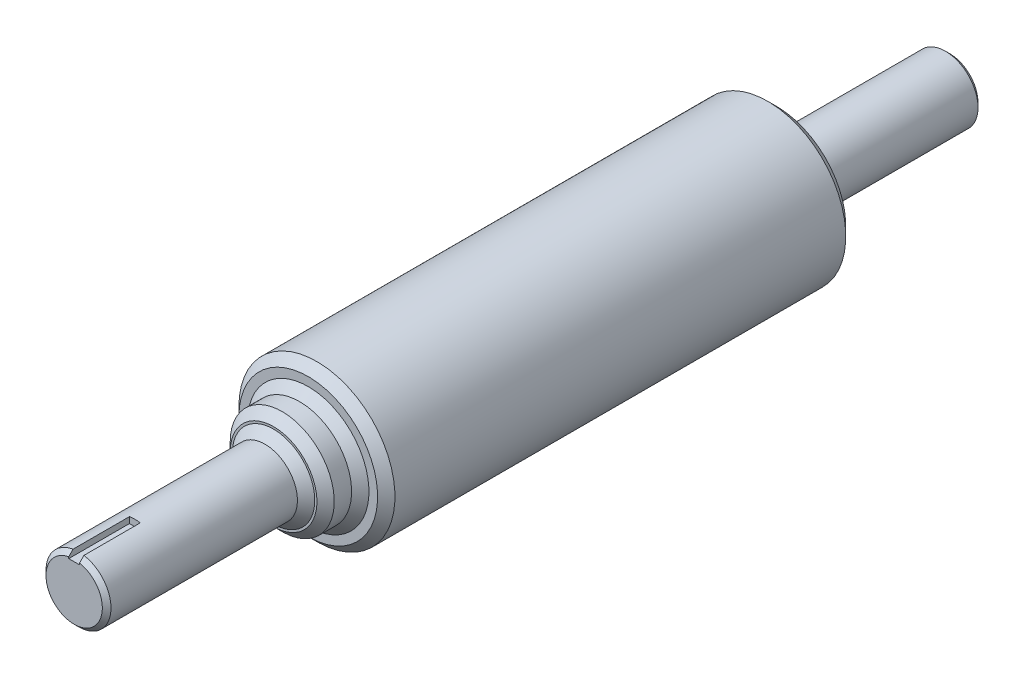
ISO-10303-21;
HEADER;
FILE_DESCRIPTION(('STEP AP214'),'2;1');
FILE_NAME('part.step','',(''),(''),'','','');
FILE_SCHEMA(('AUTOMOTIVE_DESIGN { 1 0 10303 214 1 1 1 1 }'));
ENDSEC;
DATA;
#1=APPLICATION_CONTEXT('core data for automotive mechanical design processes');
#2=APPLICATION_PROTOCOL_DEFINITION('international standard','automotive_design',2000,#1);
#3=PRODUCT_CONTEXT('',#1,'mechanical');
#4=PRODUCT('Part','Part','',(#3));
#5=PRODUCT_RELATED_PRODUCT_CATEGORY('part','',(#4));
#6=PRODUCT_DEFINITION_FORMATION('','',#4);
#7=PRODUCT_DEFINITION_CONTEXT('part definition',#1,'design');
#8=PRODUCT_DEFINITION('design','',#6,#7);
#9=PRODUCT_DEFINITION_SHAPE('','',#8);
#10=(LENGTH_UNIT() NAMED_UNIT(*) SI_UNIT(.MILLI.,.METRE.));
#11=(NAMED_UNIT(*) PLANE_ANGLE_UNIT() SI_UNIT($,.RADIAN.));
#12=(NAMED_UNIT(*) SI_UNIT($,.STERADIAN.) SOLID_ANGLE_UNIT());
#13=UNCERTAINTY_MEASURE_WITH_UNIT(LENGTH_MEASURE(1.E-05),#10,'distance_accuracy_value','');
#14=(GEOMETRIC_REPRESENTATION_CONTEXT(3) GLOBAL_UNCERTAINTY_ASSIGNED_CONTEXT((#13)) GLOBAL_UNIT_ASSIGNED_CONTEXT((#10,
#11,#12)) REPRESENTATION_CONTEXT('',''));
#15=CARTESIAN_POINT('',(0.,0.,0.));
#16=DIRECTION('',(0.,0.,1.));
#17=DIRECTION('',(1.,0.,0.));
#18=AXIS2_PLACEMENT_3D('',#15,#16,#17);
#19=CARTESIAN_POINT('',(0.,0.,-38.1));
#20=DIRECTION('',(0.,0.,1.));
#21=DIRECTION('',(1.,0.,0.));
#22=AXIS2_PLACEMENT_3D('',#19,#20,#21);
#23=CYLINDRICAL_SURFACE('',#22,47.625);
#24=CARTESIAN_POINT('',(0.,0.,-25.3999999999999));
#25=DIRECTION('',(0.,0.,-1.));
#26=DIRECTION('',(-1.,0.,0.));
#27=AXIS2_PLACEMENT_3D('',#24,#25,#26);
#28=CIRCLE('',#27,47.625);
#29=CARTESIAN_POINT('',(-47.625,0.,-25.3999999999999));
#30=VERTEX_POINT('',#29);
#31=EDGE_CURVE('E114',#30,#30,#28,.F.);
#32=ORIENTED_EDGE('',*,*,#31,.T.);
#33=EDGE_LOOP('',(#32));
#34=FACE_BOUND('',#33,.T.);
#35=DIRECTION('',(0.,0.,1.));
#36=VECTOR('',#35,1.);
#37=CARTESIAN_POINT('',(7.9375,46.9588832783532,-38.1));
#38=LINE('',#37,#36);
#39=CARTESIAN_POINT('',(7.9375,46.9588832783532,165.1));
#40=VERTEX_POINT('',#39);
#41=CARTESIAN_POINT('',(7.9375,46.9588832783532,247.65));
#42=VERTEX_POINT('',#41);
#43=EDGE_CURVE('E89',#40,#42,#38,.T.);
#44=ORIENTED_EDGE('',*,*,#43,.T.);
#45=CARTESIAN_POINT('',(0.,0.,247.65));
#46=DIRECTION('',(0.,0.,1.));
#47=DIRECTION('',(1.,0.,0.));
#48=AXIS2_PLACEMENT_3D('',#45,#46,#47);
#49=CIRCLE('',#48,47.625);
#50=CARTESIAN_POINT('',(-7.9375,46.9588832783532,247.65));
#51=VERTEX_POINT('',#50);
#52=EDGE_CURVE('E47',#42,#51,#49,.F.);
#53=ORIENTED_EDGE('',*,*,#52,.T.);
#54=DIRECTION('',(0.,0.,1.));
#55=VECTOR('',#54,1.);
#56=CARTESIAN_POINT('',(-7.9375,46.9588832783532,-38.1));
#57=LINE('',#56,#55);
#58=CARTESIAN_POINT('',(-7.9375,46.9588832783532,165.1));
#59=VERTEX_POINT('',#58);
#60=EDGE_CURVE('E106',#59,#51,#57,.T.);
#61=ORIENTED_EDGE('',*,*,#60,.F.);
#62=CARTESIAN_POINT('',(0.,0.,165.1));
#63=DIRECTION('',(0.,0.,-1.));
#64=DIRECTION('',(-1.,0.,0.));
#65=AXIS2_PLACEMENT_3D('',#62,#63,#64);
#66=CIRCLE('',#65,47.625);
#67=EDGE_CURVE('E154',#40,#59,#66,.F.);
#68=ORIENTED_EDGE('',*,*,#67,.F.);
#69=EDGE_LOOP('',(#44,#53,#61,#68));
#70=FACE_BOUND('',#69,.T.);
#71=ADVANCED_FACE('F34',(#34,#70),#23,.T.);
#72=CARTESIAN_POINT('',(0.,0.,254.));
#73=DIRECTION('',(0.,0.,1.));
#74=DIRECTION('',(1.,0.,0.));
#75=AXIS2_PLACEMENT_3D('',#72,#73,#74);
#76=PLANE('',#75);
#77=DIRECTION('',(0.,-1.,0.));
#78=VECTOR('',#77,1.);
#79=CARTESIAN_POINT('',(-7.9375,0.,254.));
#80=LINE('',#79,#78);
#81=CARTESIAN_POINT('',(-7.9375,40.5045888603997,254.));
#82=VERTEX_POINT('',#81);
#83=CARTESIAN_POINT('',(-7.9375,38.1,254.));
#84=VERTEX_POINT('',#83);
#85=EDGE_CURVE('E150',#82,#84,#80,.T.);
#86=ORIENTED_EDGE('',*,*,#85,.F.);
#87=CARTESIAN_POINT('',(0.,0.,254.));
#88=DIRECTION('',(0.,0.,1.));
#89=DIRECTION('',(1.,0.,0.));
#90=AXIS2_PLACEMENT_3D('',#87,#88,#89);
#91=CIRCLE('',#90,41.2750000000002);
#92=CARTESIAN_POINT('',(7.9375,40.5045888603997,254.));
#93=VERTEX_POINT('',#92);
#94=EDGE_CURVE('E162',#82,#93,#91,.T.);
#95=ORIENTED_EDGE('',*,*,#94,.T.);
#96=DIRECTION('',(0.,-1.,0.));
#97=VECTOR('',#96,1.);
#98=CARTESIAN_POINT('',(7.93750000000001,0.,254.));
#99=LINE('',#98,#97);
#100=CARTESIAN_POINT('',(7.9375,38.1,254.));
#101=VERTEX_POINT('',#100);
#102=EDGE_CURVE('E152',#93,#101,#99,.T.);
#103=ORIENTED_EDGE('',*,*,#102,.T.);
#104=DIRECTION('',(-1.,0.,0.));
#105=VECTOR('',#104,1.);
#106=CARTESIAN_POINT('',(7.9375,38.1,254.));
#107=LINE('',#106,#105);
#108=EDGE_CURVE('E93',#101,#84,#107,.T.);
#109=ORIENTED_EDGE('',*,*,#108,.T.);
#110=EDGE_LOOP('',(#86,#95,#103,#109));
#111=FACE_BOUND('',#110,.T.);
#112=ADVANCED_FACE('F202',(#111),#76,.T.);
#113=CARTESIAN_POINT('',(0.,0.,-88.9));
#114=DIRECTION('',(0.,0.,1.));
#115=DIRECTION('',(1.,0.,0.));
#116=AXIS2_PLACEMENT_3D('',#113,#114,#115);
#117=CYLINDRICAL_SURFACE('',#116,76.2);
#118=CARTESIAN_POINT('',(0.,0.,-76.2000000000003));
#119=DIRECTION('',(0.,0.,-1.));
#120=DIRECTION('',(-1.,0.,0.));
#121=AXIS2_PLACEMENT_3D('',#118,#119,#120);
#122=CIRCLE('',#121,76.2);
#123=CARTESIAN_POINT('',(-76.2,0.,-76.2000000000003));
#124=VERTEX_POINT('',#123);
#125=EDGE_CURVE('E132',#124,#124,#122,.F.);
#126=ORIENTED_EDGE('',*,*,#125,.T.);
#127=EDGE_LOOP('',(#126));
#128=FACE_BOUND('',#127,.T.);
#129=CARTESIAN_POINT('',(0.,0.,-50.8));
#130=DIRECTION('',(0.,0.,-1.));
#131=DIRECTION('',(-1.,0.,0.));
#132=AXIS2_PLACEMENT_3D('',#129,#130,#131);
#133=CIRCLE('',#132,76.2);
#134=CARTESIAN_POINT('',(-76.2,0.,-50.8));
#135=VERTEX_POINT('',#134);
#136=EDGE_CURVE('E129',#135,#135,#133,.T.);
#137=ORIENTED_EDGE('',*,*,#136,.T.);
#138=EDGE_LOOP('',(#137));
#139=FACE_BOUND('',#138,.T.);
#140=ADVANCED_FACE('F198',(#128,#139),#117,.T.);
#141=CARTESIAN_POINT('',(0.,0.,-38.1));
#142=DIRECTION('',(0.,0.,-1.));
#143=DIRECTION('',(-1.,0.,0.));
#144=AXIS2_PLACEMENT_3D('',#141,#142,#143);
#145=PLANE('',#144);
#146=CARTESIAN_POINT('',(0.,0.,-38.1));
#147=DIRECTION('',(0.,0.,-1.));
#148=DIRECTION('',(-1.,0.,0.));
#149=AXIS2_PLACEMENT_3D('',#146,#147,#148);
#150=CIRCLE('',#149,60.325);
#151=CARTESIAN_POINT('',(-60.325,0.,-38.1));
#152=VERTEX_POINT('',#151);
#153=EDGE_CURVE('E120',#152,#152,#150,.T.);
#154=ORIENTED_EDGE('',*,*,#153,.T.);
#155=EDGE_LOOP('',(#154));
#156=FACE_BOUND('',#155,.T.);
#157=CARTESIAN_POINT('',(0.,0.,-38.1));
#158=DIRECTION('',(0.,0.,-1.));
#159=DIRECTION('',(-1.,0.,0.));
#160=AXIS2_PLACEMENT_3D('',#157,#158,#159);
#161=CIRCLE('',#160,63.5);
#162=CARTESIAN_POINT('',(-63.5,0.,-38.1));
#163=VERTEX_POINT('',#162);
#164=EDGE_CURVE('E117',#163,#163,#161,.F.);
#165=ORIENTED_EDGE('',*,*,#164,.T.);
#166=EDGE_LOOP('',(#165));
#167=FACE_BOUND('',#166,.T.);
#168=ADVANCED_FACE('F194',(#156,#167),#145,.F.);
#169=CARTESIAN_POINT('',(0.,0.,-774.7));
#170=DIRECTION('',(0.,0.,1.));
#171=DIRECTION('',(1.,0.,0.));
#172=AXIS2_PLACEMENT_3D('',#169,#170,#171);
#173=CYLINDRICAL_SURFACE('',#172,114.3);
#174=CARTESIAN_POINT('',(0.,0.,-101.6));
#175=DIRECTION('',(0.,0.,-1.));
#176=DIRECTION('',(-1.,0.,0.));
#177=AXIS2_PLACEMENT_3D('',#174,#175,#176);
#178=CIRCLE('',#177,114.3);
#179=CARTESIAN_POINT('',(-114.3,0.,-101.6));
#180=VERTEX_POINT('',#179);
#181=EDGE_CURVE('E138',#180,#180,#178,.T.);
#182=ORIENTED_EDGE('',*,*,#181,.T.);
#183=EDGE_LOOP('',(#182));
#184=FACE_BOUND('',#183,.T.);
#185=CARTESIAN_POINT('',(0.,0.,-762.));
#186=DIRECTION('',(0.,0.,-1.));
#187=DIRECTION('',(-1.,0.,0.));
#188=AXIS2_PLACEMENT_3D('',#185,#186,#187);
#189=CIRCLE('',#188,114.3);
#190=CARTESIAN_POINT('',(-114.3,0.,-762.));
#191=VERTEX_POINT('',#190);
#192=EDGE_CURVE('E135',#191,#191,#189,.F.);
#193=ORIENTED_EDGE('',*,*,#192,.T.);
#194=EDGE_LOOP('',(#193));
#195=FACE_BOUND('',#194,.T.);
#196=ADVANCED_FACE('F187',(#184,#195),#173,.T.);
#197=CARTESIAN_POINT('',(0.,0.,-774.7));
#198=DIRECTION('',(0.,0.,-1.));
#199=DIRECTION('',(-1.,0.,0.));
#200=AXIS2_PLACEMENT_3D('',#197,#198,#199);
#201=PLANE('',#200);
#202=CARTESIAN_POINT('',(0.,0.,-774.7));
#203=DIRECTION('',(0.,0.,-1.));
#204=DIRECTION('',(-1.,0.,0.));
#205=AXIS2_PLACEMENT_3D('',#202,#203,#204);
#206=CIRCLE('',#205,101.6);
#207=CARTESIAN_POINT('',(-101.6,0.,-774.7));
#208=VERTEX_POINT('',#207);
#209=EDGE_CURVE('E144',#208,#208,#206,.T.);
#210=ORIENTED_EDGE('',*,*,#209,.T.);
#211=EDGE_LOOP('',(#210));
#212=FACE_BOUND('',#211,.T.);
#213=CARTESIAN_POINT('',(0.,0.,-774.7));
#214=DIRECTION('',(0.,0.,-1.));
#215=DIRECTION('',(-1.,0.,0.));
#216=AXIS2_PLACEMENT_3D('',#213,#214,#215);
#217=CIRCLE('',#216,60.3250000000001);
#218=CARTESIAN_POINT('',(60.3250000000001,0.,-774.7));
#219=VERTEX_POINT('',#218);
#220=EDGE_CURVE('E141',#219,#219,#217,.F.);
#221=ORIENTED_EDGE('',*,*,#220,.T.);
#222=EDGE_LOOP('',(#221));
#223=FACE_BOUND('',#222,.T.);
#224=ADVANCED_FACE('F184',(#212,#223),#201,.T.);
#225=CARTESIAN_POINT('',(0.,0.,-88.9));
#226=DIRECTION('',(0.,0.,-1.));
#227=DIRECTION('',(-1.,0.,0.));
#228=AXIS2_PLACEMENT_3D('',#225,#226,#227);
#229=PLANE('',#228);
#230=CARTESIAN_POINT('',(0.,0.,-88.9));
#231=DIRECTION('',(0.,0.,-1.));
#232=DIRECTION('',(-1.,0.,0.));
#233=AXIS2_PLACEMENT_3D('',#230,#231,#232);
#234=CIRCLE('',#233,88.8999999999997);
#235=CARTESIAN_POINT('',(-88.8999999999997,0.,-88.9));
#236=VERTEX_POINT('',#235);
#237=EDGE_CURVE('E126',#236,#236,#234,.T.);
#238=ORIENTED_EDGE('',*,*,#237,.T.);
#239=EDGE_LOOP('',(#238));
#240=FACE_BOUND('',#239,.T.);
#241=CARTESIAN_POINT('',(0.,0.,-88.9));
#242=DIRECTION('',(0.,0.,-1.));
#243=DIRECTION('',(-1.,0.,0.));
#244=AXIS2_PLACEMENT_3D('',#241,#242,#243);
#245=CIRCLE('',#244,101.6);
#246=CARTESIAN_POINT('',(-101.6,0.,-88.9));
#247=VERTEX_POINT('',#246);
#248=EDGE_CURVE('E123',#247,#247,#245,.F.);
#249=ORIENTED_EDGE('',*,*,#248,.T.);
#250=EDGE_LOOP('',(#249));
#251=FACE_BOUND('',#250,.T.);
#252=ADVANCED_FACE('F182',(#240,#251),#229,.F.);
#253=CARTESIAN_POINT('',(0.,0.,-1028.7));
#254=DIRECTION('',(0.,0.,1.));
#255=DIRECTION('',(1.,0.,0.));
#256=AXIS2_PLACEMENT_3D('',#253,#254,#255);
#257=CYLINDRICAL_SURFACE('',#256,47.625);
#258=CARTESIAN_POINT('',(0.,0.,-1022.35));
#259=DIRECTION('',(0.,0.,-1.));
#260=DIRECTION('',(-1.,0.,0.));
#261=AXIS2_PLACEMENT_3D('',#258,#259,#260);
#262=CIRCLE('',#261,47.625);
#263=CARTESIAN_POINT('',(-47.625,0.,-1022.35));
#264=VERTEX_POINT('',#263);
#265=EDGE_CURVE('E159',#264,#264,#262,.F.);
#266=ORIENTED_EDGE('',*,*,#265,.T.);
#267=EDGE_LOOP('',(#266));
#268=FACE_BOUND('',#267,.T.);
#269=CARTESIAN_POINT('',(0.,0.,-787.4));
#270=DIRECTION('',(0.,0.,-1.));
#271=DIRECTION('',(-1.,0.,0.));
#272=AXIS2_PLACEMENT_3D('',#269,#270,#271);
#273=CIRCLE('',#272,47.625);
#274=CARTESIAN_POINT('',(47.6250000000001,0.,-787.4));
#275=VERTEX_POINT('',#274);
#276=EDGE_CURVE('E147',#275,#275,#273,.T.);
#277=ORIENTED_EDGE('',*,*,#276,.T.);
#278=EDGE_LOOP('',(#277));
#279=FACE_BOUND('',#278,.T.);
#280=ADVANCED_FACE('F178',(#268,#279),#257,.T.);
#281=CARTESIAN_POINT('',(0.,0.,-1028.7));
#282=DIRECTION('',(0.,0.,-1.));
#283=DIRECTION('',(-1.,0.,0.));
#284=AXIS2_PLACEMENT_3D('',#281,#282,#283);
#285=PLANE('',#284);
#286=CARTESIAN_POINT('',(0.,0.,-1028.7));
#287=DIRECTION('',(0.,0.,-1.));
#288=DIRECTION('',(-1.,0.,0.));
#289=AXIS2_PLACEMENT_3D('',#286,#287,#288);
#290=CIRCLE('',#289,41.2749999999999);
#291=CARTESIAN_POINT('',(-41.2749999999999,0.,-1028.7));
#292=VERTEX_POINT('',#291);
#293=EDGE_CURVE('E156',#292,#292,#290,.T.);
#294=ORIENTED_EDGE('',*,*,#293,.T.);
#295=EDGE_LOOP('',(#294));
#296=FACE_BOUND('',#295,.T.);
#297=ADVANCED_FACE('F174',(#296),#285,.T.);
#298=CARTESIAN_POINT('',(0.,0.,-25.3999999999999));
#299=DIRECTION('',(0.,0.,-1.));
#300=DIRECTION('',(-1.,0.,0.));
#301=AXIS2_PLACEMENT_3D('',#298,#299,#300);
#302=CONICAL_SURFACE('',#301,47.625,0.785398163397441);
#303=ORIENTED_EDGE('',*,*,#153,.F.);
#304=EDGE_LOOP('',(#303));
#305=FACE_BOUND('',#304,.T.);
#306=ORIENTED_EDGE('',*,*,#31,.F.);
#307=EDGE_LOOP('',(#306));
#308=FACE_BOUND('',#307,.T.);
#309=ADVANCED_FACE('F177',(#305,#308),#302,.T.);
#310=CARTESIAN_POINT('',(0.,0.,-88.9));
#311=DIRECTION('',(0.,0.,-1.));
#312=DIRECTION('',(-1.,0.,0.));
#313=AXIS2_PLACEMENT_3D('',#310,#311,#312);
#314=CONICAL_SURFACE('',#313,88.8999999999997,0.785398163397449);
#315=ORIENTED_EDGE('',*,*,#125,.F.);
#316=EDGE_LOOP('',(#315));
#317=FACE_BOUND('',#316,.T.);
#318=ORIENTED_EDGE('',*,*,#237,.F.);
#319=EDGE_LOOP('',(#318));
#320=FACE_BOUND('',#319,.T.);
#321=ADVANCED_FACE('F212',(#317,#320),#314,.T.);
#322=CARTESIAN_POINT('',(0.,0.,-50.8));
#323=DIRECTION('',(0.,0.,-1.));
#324=DIRECTION('',(-1.,0.,0.));
#325=AXIS2_PLACEMENT_3D('',#322,#323,#324);
#326=CONICAL_SURFACE('',#325,76.2,0.785398163397449);
#327=ORIENTED_EDGE('',*,*,#164,.F.);
#328=EDGE_LOOP('',(#327));
#329=FACE_BOUND('',#328,.T.);
#330=ORIENTED_EDGE('',*,*,#136,.F.);
#331=EDGE_LOOP('',(#330));
#332=FACE_BOUND('',#331,.T.);
#333=ADVANCED_FACE('F216',(#329,#332),#326,.T.);
#334=CARTESIAN_POINT('',(0.,0.,-101.6));
#335=DIRECTION('',(0.,0.,-1.));
#336=DIRECTION('',(-1.,0.,0.));
#337=AXIS2_PLACEMENT_3D('',#334,#335,#336);
#338=CONICAL_SURFACE('',#337,114.3,0.785398163397451);
#339=ORIENTED_EDGE('',*,*,#248,.F.);
#340=EDGE_LOOP('',(#339));
#341=FACE_BOUND('',#340,.T.);
#342=ORIENTED_EDGE('',*,*,#181,.F.);
#343=EDGE_LOOP('',(#342));
#344=FACE_BOUND('',#343,.T.);
#345=ADVANCED_FACE('F220',(#341,#344),#338,.T.);
#346=CARTESIAN_POINT('',(0.,0.,-774.7));
#347=DIRECTION('',(0.,0.,1.));
#348=DIRECTION('',(1.,0.,0.));
#349=AXIS2_PLACEMENT_3D('',#346,#347,#348);
#350=CONICAL_SURFACE('',#349,101.6,0.785398163397437);
#351=ORIENTED_EDGE('',*,*,#192,.F.);
#352=EDGE_LOOP('',(#351));
#353=FACE_BOUND('',#352,.T.);
#354=ORIENTED_EDGE('',*,*,#209,.F.);
#355=EDGE_LOOP('',(#354));
#356=FACE_BOUND('',#355,.T.);
#357=ADVANCED_FACE('F224',(#353,#356),#350,.T.);
#358=CARTESIAN_POINT('',(0.,0.,-787.4));
#359=DIRECTION('',(0.,0.,1.));
#360=DIRECTION('',(1.,0.,0.));
#361=AXIS2_PLACEMENT_3D('',#358,#359,#360);
#362=CONICAL_SURFACE('',#361,47.625,0.785398163397449);
#363=CARTESIAN_POINT('',(60.3250000000001,0.,-774.7));
#364=CARTESIAN_POINT('',(60.1927083333335,0.,-774.832291666667));
#365=CARTESIAN_POINT('',(60.0604166666668,0.,-774.964583333333));
#366=CARTESIAN_POINT('',(59.7958333333335,0.,-775.229166666667));
#367=CARTESIAN_POINT('',(59.6635416666668,0.,-775.361458333333));
#368=CARTESIAN_POINT('',(59.3989583333335,0.,-775.626041666667));
#369=CARTESIAN_POINT('',(59.2666666666668,0.,-775.758333333333));
#370=CARTESIAN_POINT('',(59.0020833333335,0.,-776.022916666667));
#371=CARTESIAN_POINT('',(58.8697916666668,0.,-776.155208333333));
#372=CARTESIAN_POINT('',(58.6052083333335,0.,-776.419791666666));
#373=CARTESIAN_POINT('',(58.4729166666668,0.,-776.552083333333));
#374=CARTESIAN_POINT('',(58.2083333333334,0.,-776.816666666667));
#375=CARTESIAN_POINT('',(58.0760416666668,0.,-776.948958333333));
#376=CARTESIAN_POINT('',(57.8114583333335,0.,-777.213541666667));
#377=CARTESIAN_POINT('',(57.6791666666668,0.,-777.345833333333));
#378=CARTESIAN_POINT('',(57.4145833333334,0.,-777.610416666667));
#379=CARTESIAN_POINT('',(57.2822916666668,0.,-777.742708333333));
#380=CARTESIAN_POINT('',(57.0177083333334,0.,-778.007291666667));
#381=CARTESIAN_POINT('',(56.8854166666668,0.,-778.139583333333));
#382=CARTESIAN_POINT('',(56.6208333333335,0.,-778.404166666667));
#383=CARTESIAN_POINT('',(56.4885416666668,0.,-778.536458333333));
#384=CARTESIAN_POINT('',(56.2239583333334,0.,-778.801041666666));
#385=CARTESIAN_POINT('',(56.0916666666668,0.,-778.933333333333));
#386=CARTESIAN_POINT('',(55.8270833333334,0.,-779.197916666667));
#387=CARTESIAN_POINT('',(55.6947916666668,0.,-779.330208333333));
#388=CARTESIAN_POINT('',(55.4302083333335,0.,-779.594791666667));
#389=CARTESIAN_POINT('',(55.2979166666668,0.,-779.727083333333));
#390=CARTESIAN_POINT('',(55.0333333333334,0.,-779.991666666667));
#391=CARTESIAN_POINT('',(54.9010416666668,0.,-780.123958333333));
#392=CARTESIAN_POINT('',(54.6364583333334,0.,-780.388541666667));
#393=CARTESIAN_POINT('',(54.5041666666668,0.,-780.520833333333));
#394=CARTESIAN_POINT('',(54.2395833333334,0.,-780.785416666667));
#395=CARTESIAN_POINT('',(54.1072916666668,0.,-780.917708333333));
#396=CARTESIAN_POINT('',(53.8427083333334,0.,-781.182291666667));
#397=CARTESIAN_POINT('',(53.7104166666668,0.,-781.314583333333));
#398=CARTESIAN_POINT('',(53.4458333333334,0.,-781.579166666667));
#399=CARTESIAN_POINT('',(53.3135416666668,0.,-781.711458333333));
#400=CARTESIAN_POINT('',(53.0489583333335,0.,-781.976041666667));
#401=CARTESIAN_POINT('',(52.9166666666668,0.,-782.108333333333));
#402=CARTESIAN_POINT('',(52.6520833333334,0.,-782.372916666667));
#403=CARTESIAN_POINT('',(52.5197916666668,0.,-782.505208333333));
#404=CARTESIAN_POINT('',(52.2552083333334,0.,-782.769791666667));
#405=CARTESIAN_POINT('',(52.1229166666668,0.,-782.902083333333));
#406=CARTESIAN_POINT('',(51.8583333333334,0.,-783.166666666667));
#407=CARTESIAN_POINT('',(51.7260416666668,0.,-783.298958333333));
#408=CARTESIAN_POINT('',(51.4614583333334,0.,-783.563541666667));
#409=CARTESIAN_POINT('',(51.3291666666668,0.,-783.695833333333));
#410=CARTESIAN_POINT('',(51.0645833333334,0.,-783.960416666667));
#411=CARTESIAN_POINT('',(50.9322916666668,0.,-784.092708333333));
#412=CARTESIAN_POINT('',(50.6677083333334,0.,-784.357291666667));
#413=CARTESIAN_POINT('',(50.5354166666668,0.,-784.489583333333));
#414=CARTESIAN_POINT('',(50.2708333333334,0.,-784.754166666666));
#415=CARTESIAN_POINT('',(50.1385416666667,0.,-784.886458333333));
#416=CARTESIAN_POINT('',(49.8739583333334,0.,-785.151041666667));
#417=CARTESIAN_POINT('',(49.7416666666668,0.,-785.283333333333));
#418=CARTESIAN_POINT('',(49.4770833333334,0.,-785.547916666667));
#419=CARTESIAN_POINT('',(49.3447916666668,0.,-785.680208333333));
#420=CARTESIAN_POINT('',(49.0802083333334,0.,-785.944791666667));
#421=CARTESIAN_POINT('',(48.9479166666667,0.,-786.077083333333));
#422=CARTESIAN_POINT('',(48.6833333333334,0.,-786.341666666667));
#423=CARTESIAN_POINT('',(48.5510416666668,0.,-786.473958333333));
#424=CARTESIAN_POINT('',(48.2864583333334,0.,-786.738541666667));
#425=CARTESIAN_POINT('',(48.1541666666667,0.,-786.870833333333));
#426=CARTESIAN_POINT('',(47.8895833333334,0.,-787.135416666667));
#427=CARTESIAN_POINT('',(47.7572916666667,0.,-787.267708333333));
#428=CARTESIAN_POINT('',(47.6250000000001,0.,-787.4));
#429=B_SPLINE_CURVE_WITH_KNOTS('',3,(#363,#364,#365,#366,#367,#368,#369,#370,#371,#372,#373,
#374,#375,#376,#377,#378,#379,#380,#381,#382,#383,#384,#385,#386,#387,#388,#389,#390,#391,#392,
#393,#394,#395,#396,#397,#398,#399,#400,#401,#402,#403,#404,#405,#406,#407,#408,#409,#410,#411,
#412,#413,#414,#415,#416,#417,#418,#419,#420,#421,#422,#423,#424,#425,#426,#427,#428),
.UNSPECIFIED.,.F.,.F.,(4,2,2,2,2,2,2,2,2,2,2,2,2,2,2,2,2,2,2,2,2,2,2,2,2,2,2,2,2,2,2,2,4),(0.,
0.561266007566878,1.12253201513367,1.68379802270055,2.24506403026735,2.80633003783415,
3.36759604540102,3.92886205296782,4.49012806053462,5.05139406810149,5.61266007566829,
6.17392608323508,6.73519209080196,7.29645809836876,7.85772410593556,8.41899011350243,
8.98025612106923,9.54152212863603,10.1027881362029,10.6640541437697,11.2253201513365,
11.7865861589034,12.3478521664702,12.909118174037,13.4703841816038,14.0316501891706,
14.5929161967374,15.1541822043043,15.7154482118711,16.2767142194379,16.8379802270048,
17.3992462345716,17.9605122421385),.UNSPECIFIED.);
#430=EDGE_CURVE('BSEAM173',#219,#275,#429,.T.);
#431=ORIENTED_EDGE('',*,*,#220,.F.);
#432=ORIENTED_EDGE('',*,*,#276,.F.);
#433=ORIENTED_EDGE('',*,*,#430,.T.);
#434=ORIENTED_EDGE('',*,*,#430,.F.);
#435=EDGE_LOOP('',(#431,#433,#432,#434));
#436=FACE_BOUND('',#435,.T.);
#437=ADVANCED_FACE('F173',(#436),#362,.T.);
#438=CARTESIAN_POINT('',(7.9375,57.15,165.1));
#439=DIRECTION('',(-1.,0.,0.));
#440=DIRECTION('',(0.,-1.,0.));
#441=AXIS2_PLACEMENT_3D('',#438,#439,#440);
#442=PLANE('',#441);
#443=ORIENTED_EDGE('',*,*,#102,.F.);
#444=CARTESIAN_POINT('',(7.9375,40.5045888603997,254.));
#445=CARTESIAN_POINT('',(7.9375,41.0431203291679,253.471518357263));
#446=CARTESIAN_POINT('',(7.9375,41.5814589735674,252.942840278883));
#447=CARTESIAN_POINT('',(7.9375,42.6577880204364,251.885130118941));
#448=CARTESIAN_POINT('',(7.9375,43.195778423028,251.356098037504));
#449=CARTESIAN_POINT('',(7.9375,44.2714487334401,250.297718405543));
#450=CARTESIAN_POINT('',(7.9375,44.809128641282,249.768370855041));
#451=CARTESIAN_POINT('',(7.9375,45.8842084483238,248.709391106294));
#452=CARTESIAN_POINT('',(7.9375,46.4216083474255,248.179758907951));
#453=CARTESIAN_POINT('',(7.9375,46.9588832783532,247.65));
#454=B_SPLINE_CURVE_WITH_KNOTS('',3,(#444,#445,#446,#447,#448,#449,#450,#451,#452,#453),
.UNSPECIFIED.,.F.,.F.,(4,2,2,2,4),(0.,2.26357690951798,4.5271530256796,6.79072898572588,
9.05430573856297),.UNSPECIFIED.);
#455=EDGE_CURVE('E61',#93,#42,#454,.T.);
#456=ORIENTED_EDGE('',*,*,#455,.T.);
#457=ORIENTED_EDGE('',*,*,#43,.F.);
#458=DIRECTION('',(0.,-1.,0.));
#459=VECTOR('',#458,1.);
#460=CARTESIAN_POINT('',(7.9375,57.15,165.1));
#461=LINE('',#460,#459);
#462=CARTESIAN_POINT('',(7.9375,38.1,165.1));
#463=VERTEX_POINT('',#462);
#464=EDGE_CURVE('E84',#40,#463,#461,.T.);
#465=ORIENTED_EDGE('',*,*,#464,.T.);
#466=DIRECTION('',(0.,0.,1.));
#467=VECTOR('',#466,1.);
#468=CARTESIAN_POINT('',(7.9375,38.1,165.1));
#469=LINE('',#468,#467);
#470=EDGE_CURVE('E88',#463,#101,#469,.T.);
#471=ORIENTED_EDGE('',*,*,#470,.T.);
#472=EDGE_LOOP('',(#443,#456,#457,#465,#471));
#473=FACE_BOUND('',#472,.T.);
#474=ADVANCED_FACE('F86',(#473),#442,.T.);
#475=CARTESIAN_POINT('',(7.9375,38.1,165.1));
#476=DIRECTION('',(0.,1.,0.));
#477=DIRECTION('',(0.,0.,1.));
#478=AXIS2_PLACEMENT_3D('',#475,#476,#477);
#479=PLANE('',#478);
#480=ORIENTED_EDGE('',*,*,#108,.F.);
#481=ORIENTED_EDGE('',*,*,#470,.F.);
#482=DIRECTION('',(-1.,0.,0.));
#483=VECTOR('',#482,1.);
#484=CARTESIAN_POINT('',(7.9375,38.1,165.1));
#485=LINE('',#484,#483);
#486=CARTESIAN_POINT('',(-7.9375,38.1,165.1));
#487=VERTEX_POINT('',#486);
#488=EDGE_CURVE('E92',#463,#487,#485,.T.);
#489=ORIENTED_EDGE('',*,*,#488,.T.);
#490=DIRECTION('',(0.,0.,1.));
#491=VECTOR('',#490,1.);
#492=CARTESIAN_POINT('',(-7.9375,38.1,165.1));
#493=LINE('',#492,#491);
#494=EDGE_CURVE('E107',#487,#84,#493,.T.);
#495=ORIENTED_EDGE('',*,*,#494,.T.);
#496=EDGE_LOOP('',(#480,#481,#489,#495));
#497=FACE_BOUND('',#496,.T.);
#498=ADVANCED_FACE('F104',(#497),#479,.T.);
#499=CARTESIAN_POINT('',(-7.9375,57.15,165.1));
#500=DIRECTION('',(-1.,0.,0.));
#501=DIRECTION('',(0.,-1.,0.));
#502=AXIS2_PLACEMENT_3D('',#499,#500,#501);
#503=PLANE('',#502);
#504=ORIENTED_EDGE('',*,*,#60,.T.);
#505=CARTESIAN_POINT('',(-7.9375,46.9588832783532,247.65));
#506=CARTESIAN_POINT('',(-7.9375,46.4216083474255,248.179758907951));
#507=CARTESIAN_POINT('',(-7.9375,45.8842084483238,248.709391106294));
#508=CARTESIAN_POINT('',(-7.9375,44.809128641282,249.768370855041));
#509=CARTESIAN_POINT('',(-7.9375,44.2714487334401,250.297718405543));
#510=CARTESIAN_POINT('',(-7.9375,43.195778423028,251.356098037504));
#511=CARTESIAN_POINT('',(-7.9375,42.6577880204364,251.885130118941));
#512=CARTESIAN_POINT('',(-7.9375,41.5814589735673,252.942840278883));
#513=CARTESIAN_POINT('',(-7.9375,41.0431203291679,253.471518357263));
#514=CARTESIAN_POINT('',(-7.9375,40.5045888603997,254.));
#515=B_SPLINE_CURVE_WITH_KNOTS('',3,(#505,#506,#507,#508,#509,#510,#511,#512,#513,#514),
.UNSPECIFIED.,.F.,.F.,(4,2,2,2,4),(0.,2.2635767528371,4.52715271288341,6.79072882904505,
9.05430573856298),.UNSPECIFIED.);
#516=EDGE_CURVE('E11',#51,#82,#515,.T.);
#517=ORIENTED_EDGE('',*,*,#516,.T.);
#518=ORIENTED_EDGE('',*,*,#85,.T.);
#519=ORIENTED_EDGE('',*,*,#494,.F.);
#520=DIRECTION('',(0.,-1.,0.));
#521=VECTOR('',#520,1.);
#522=CARTESIAN_POINT('',(-7.9375,57.15,165.1));
#523=LINE('',#522,#521);
#524=EDGE_CURVE('E98',#59,#487,#523,.T.);
#525=ORIENTED_EDGE('',*,*,#524,.F.);
#526=EDGE_LOOP('',(#504,#517,#518,#519,#525));
#527=FACE_BOUND('',#526,.T.);
#528=ADVANCED_FACE('F239',(#527),#503,.F.);
#529=CARTESIAN_POINT('',(0.,0.,165.1));
#530=DIRECTION('',(0.,0.,-1.));
#531=DIRECTION('',(-1.,0.,0.));
#532=AXIS2_PLACEMENT_3D('',#529,#530,#531);
#533=PLANE('',#532);
#534=ORIENTED_EDGE('',*,*,#67,.T.);
#535=ORIENTED_EDGE('',*,*,#524,.T.);
#536=ORIENTED_EDGE('',*,*,#488,.F.);
#537=ORIENTED_EDGE('',*,*,#464,.F.);
#538=EDGE_LOOP('',(#534,#535,#536,#537));
#539=FACE_BOUND('',#538,.T.);
#540=ADVANCED_FACE('F96',(#539),#533,.F.);
#541=CARTESIAN_POINT('',(0.,0.,-1028.7));
#542=DIRECTION('',(0.,0.,1.));
#543=DIRECTION('',(1.,0.,0.));
#544=AXIS2_PLACEMENT_3D('',#541,#542,#543);
#545=CONICAL_SURFACE('',#544,41.2749999999999,0.78539816339743);
#546=ORIENTED_EDGE('',*,*,#265,.F.);
#547=EDGE_LOOP('',(#546));
#548=FACE_BOUND('',#547,.T.);
#549=ORIENTED_EDGE('',*,*,#293,.F.);
#550=EDGE_LOOP('',(#549));
#551=FACE_BOUND('',#550,.T.);
#552=ADVANCED_FACE('F231',(#548,#551),#545,.T.);
#553=CARTESIAN_POINT('',(0.,0.,254.));
#554=DIRECTION('',(0.,0.,-1.));
#555=DIRECTION('',(-1.,0.,0.));
#556=AXIS2_PLACEMENT_3D('',#553,#554,#555);
#557=CONICAL_SURFACE('',#556,41.2750000000002,0.785398163397446);
#558=ORIENTED_EDGE('',*,*,#516,.F.);
#559=ORIENTED_EDGE('',*,*,#52,.F.);
#560=ORIENTED_EDGE('',*,*,#455,.F.);
#561=ORIENTED_EDGE('',*,*,#94,.F.);
#562=EDGE_LOOP('',(#558,#559,#560,#561));
#563=FACE_BOUND('',#562,.T.);
#564=ADVANCED_FACE('F36',(#563),#557,.T.);
#565=CLOSED_SHELL('',(#71,#112,#140,#168,#196,#224,#252,#280,#297,#309,#321,#333,#345,#357,#437,
#474,#498,#528,#540,#552,#564));
#566=MANIFOLD_SOLID_BREP('B2',#565);
#567=ADVANCED_BREP_SHAPE_REPRESENTATION('',(#18,#566),#14);
#568=SHAPE_DEFINITION_REPRESENTATION(#9,#567);
ENDSEC;
END-ISO-10303-21;
